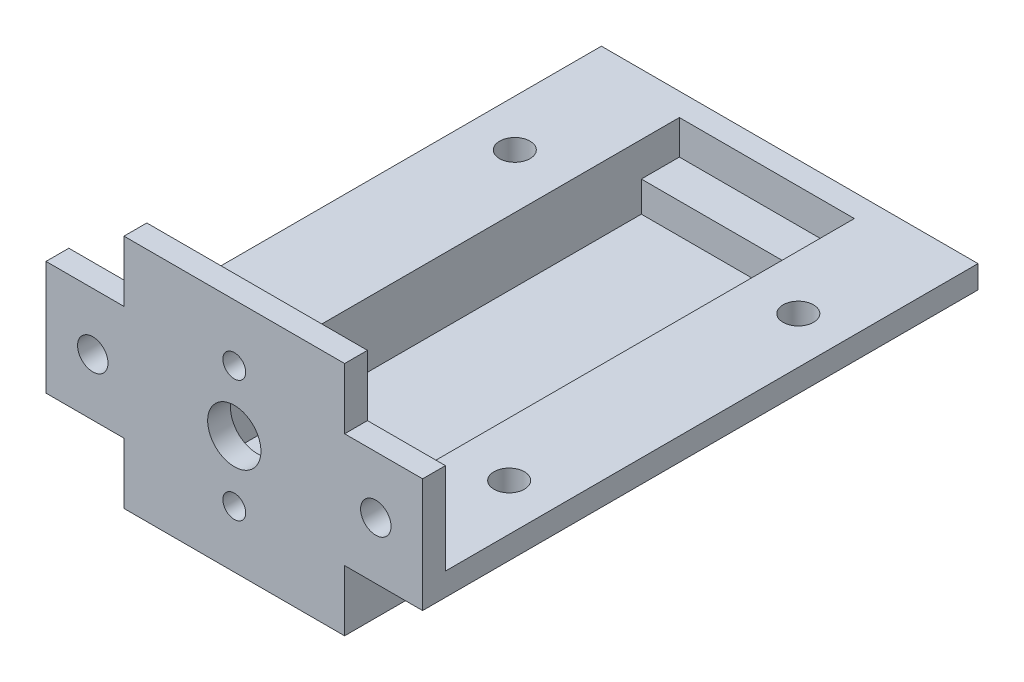
ISO-10303-21;
HEADER;
FILE_DESCRIPTION(('STEP AP214'),'2;1');
FILE_NAME('part.step','',(''),(''),'','','');
FILE_SCHEMA(('AUTOMOTIVE_DESIGN { 1 0 10303 214 1 1 1 1 }'));
ENDSEC;
DATA;
#1=APPLICATION_CONTEXT('core data for automotive mechanical design processes');
#2=APPLICATION_PROTOCOL_DEFINITION('international standard','automotive_design',2000,#1);
#3=PRODUCT_CONTEXT('',#1,'mechanical');
#4=PRODUCT('Part','Part','',(#3));
#5=PRODUCT_RELATED_PRODUCT_CATEGORY('part','',(#4));
#6=PRODUCT_DEFINITION_FORMATION('','',#4);
#7=PRODUCT_DEFINITION_CONTEXT('part definition',#1,'design');
#8=PRODUCT_DEFINITION('design','',#6,#7);
#9=PRODUCT_DEFINITION_SHAPE('','',#8);
#10=(LENGTH_UNIT() NAMED_UNIT(*) SI_UNIT(.MILLI.,.METRE.));
#11=(NAMED_UNIT(*) PLANE_ANGLE_UNIT() SI_UNIT($,.RADIAN.));
#12=(NAMED_UNIT(*) SI_UNIT($,.STERADIAN.) SOLID_ANGLE_UNIT());
#13=UNCERTAINTY_MEASURE_WITH_UNIT(LENGTH_MEASURE(1.E-05),#10,'distance_accuracy_value','');
#14=(GEOMETRIC_REPRESENTATION_CONTEXT(3) GLOBAL_UNCERTAINTY_ASSIGNED_CONTEXT((#13)) GLOBAL_UNIT_ASSIGNED_CONTEXT((#10,
#11,#12)) REPRESENTATION_CONTEXT('',''));
#15=CARTESIAN_POINT('',(0.,0.,0.));
#16=DIRECTION('',(0.,0.,1.));
#17=DIRECTION('',(1.,0.,0.));
#18=AXIS2_PLACEMENT_3D('',#15,#16,#17);
#19=CARTESIAN_POINT('',(-11.5,-12.5,0.));
#20=DIRECTION('',(-1.,0.,0.));
#21=DIRECTION('',(0.,-1.,0.));
#22=AXIS2_PLACEMENT_3D('',#19,#20,#21);
#23=PLANE('',#22);
#24=DIRECTION('',(0.,-1.,0.));
#25=VECTOR('',#24,1.);
#26=CARTESIAN_POINT('',(-11.5,-8.5,-62.));
#27=LINE('',#26,#25);
#28=CARTESIAN_POINT('',(-11.5,-8.5,-62.));
#29=VERTEX_POINT('',#28);
#30=CARTESIAN_POINT('',(-11.5,-12.5,-62.));
#31=VERTEX_POINT('',#30);
#32=EDGE_CURVE('E63',#29,#31,#27,.T.);
#33=ORIENTED_EDGE('',*,*,#32,.F.);
#34=DIRECTION('',(0.,0.,1.));
#35=VECTOR('',#34,1.);
#36=CARTESIAN_POINT('',(-11.5,-8.5,-67.));
#37=LINE('',#36,#35);
#38=CARTESIAN_POINT('',(-11.5,-8.5,-67.));
#39=VERTEX_POINT('',#38);
#40=EDGE_CURVE('E68',#39,#29,#37,.T.);
#41=ORIENTED_EDGE('',*,*,#40,.F.);
#42=DIRECTION('',(0.,1.,0.));
#43=VECTOR('',#42,1.);
#44=CARTESIAN_POINT('',(-11.5,-12.5,-67.));
#45=LINE('',#44,#43);
#46=CARTESIAN_POINT('',(-11.5,-4.,-67.));
#47=VERTEX_POINT('',#46);
#48=EDGE_CURVE('E260',#39,#47,#45,.T.);
#49=ORIENTED_EDGE('',*,*,#48,.T.);
#50=DIRECTION('',(0.,0.,1.));
#51=VECTOR('',#50,1.);
#52=CARTESIAN_POINT('',(-11.5,-4.,0.));
#53=LINE('',#52,#51);
#54=CARTESIAN_POINT('',(-11.5,-4.,0.));
#55=VERTEX_POINT('',#54);
#56=EDGE_CURVE('E250',#47,#55,#53,.T.);
#57=ORIENTED_EDGE('',*,*,#56,.T.);
#58=DIRECTION('',(0.,1.,0.));
#59=VECTOR('',#58,1.);
#60=CARTESIAN_POINT('',(-11.5,-12.5,0.));
#61=LINE('',#60,#59);
#62=CARTESIAN_POINT('',(-11.5,-12.5,0.));
#63=VERTEX_POINT('',#62);
#64=EDGE_CURVE('E194',#63,#55,#61,.T.);
#65=ORIENTED_EDGE('',*,*,#64,.F.);
#66=DIRECTION('',(0.,0.,1.));
#67=VECTOR('',#66,1.);
#68=CARTESIAN_POINT('',(-11.5,-12.5,0.));
#69=LINE('',#68,#67);
#70=EDGE_CURVE('E244',#31,#63,#69,.T.);
#71=ORIENTED_EDGE('',*,*,#70,.F.);
#72=EDGE_LOOP('',(#33,#41,#49,#57,#65,#71));
#73=FACE_BOUND('',#72,.T.);
#74=ADVANCED_FACE('F45',(#73),#23,.F.);
#75=CARTESIAN_POINT('',(11.5,-12.5,0.));
#76=DIRECTION('',(1.,0.,0.));
#77=DIRECTION('',(0.,1.,0.));
#78=AXIS2_PLACEMENT_3D('',#75,#76,#77);
#79=PLANE('',#78);
#80=DIRECTION('',(0.,-1.,0.));
#81=VECTOR('',#80,1.);
#82=CARTESIAN_POINT('',(11.5,-8.5,-62.));
#83=LINE('',#82,#81);
#84=CARTESIAN_POINT('',(11.5,-8.5,-62.));
#85=VERTEX_POINT('',#84);
#86=CARTESIAN_POINT('',(11.5,-12.5,-62.));
#87=VERTEX_POINT('',#86);
#88=EDGE_CURVE('E197',#85,#87,#83,.T.);
#89=ORIENTED_EDGE('',*,*,#88,.T.);
#90=DIRECTION('',(0.,0.,-1.));
#91=VECTOR('',#90,1.);
#92=CARTESIAN_POINT('',(11.5,-12.5,0.));
#93=LINE('',#92,#91);
#94=CARTESIAN_POINT('',(11.5,-12.5,0.));
#95=VERTEX_POINT('',#94);
#96=EDGE_CURVE('E185',#95,#87,#93,.T.);
#97=ORIENTED_EDGE('',*,*,#96,.F.);
#98=DIRECTION('',(0.,1.,0.));
#99=VECTOR('',#98,1.);
#100=CARTESIAN_POINT('',(11.5,-12.5,0.));
#101=LINE('',#100,#99);
#102=CARTESIAN_POINT('',(11.5,-4.00000000000001,0.));
#103=VERTEX_POINT('',#102);
#104=EDGE_CURVE('E267',#95,#103,#101,.T.);
#105=ORIENTED_EDGE('',*,*,#104,.T.);
#106=DIRECTION('',(0.,0.,-1.));
#107=VECTOR('',#106,1.);
#108=CARTESIAN_POINT('',(11.5,-4.00000000000001,0.));
#109=LINE('',#108,#107);
#110=CARTESIAN_POINT('',(11.5,-4.00000000000001,-67.));
#111=VERTEX_POINT('',#110);
#112=EDGE_CURVE('E253',#103,#111,#109,.T.);
#113=ORIENTED_EDGE('',*,*,#112,.T.);
#114=DIRECTION('',(0.,1.,0.));
#115=VECTOR('',#114,1.);
#116=CARTESIAN_POINT('',(11.5,-12.5,-67.));
#117=LINE('',#116,#115);
#118=CARTESIAN_POINT('',(11.5,-8.5,-67.));
#119=VERTEX_POINT('',#118);
#120=EDGE_CURVE('E264',#119,#111,#117,.T.);
#121=ORIENTED_EDGE('',*,*,#120,.F.);
#122=DIRECTION('',(0.,0.,-1.));
#123=VECTOR('',#122,1.);
#124=CARTESIAN_POINT('',(11.5,-8.5,-67.));
#125=LINE('',#124,#123);
#126=EDGE_CURVE('E201',#85,#119,#125,.T.);
#127=ORIENTED_EDGE('',*,*,#126,.F.);
#128=EDGE_LOOP('',(#89,#97,#105,#113,#121,#127));
#129=FACE_BOUND('',#128,.T.);
#130=ADVANCED_FACE('F198',(#129),#79,.F.);
#131=CARTESIAN_POINT('',(0.,-12.5,0.));
#132=DIRECTION('',(0.,-1.,0.));
#133=DIRECTION('',(1.,0.,0.));
#134=AXIS2_PLACEMENT_3D('',#131,#132,#133);
#135=PLANE('',#134);
#136=DIRECTION('',(1.,0.,0.));
#137=VECTOR('',#136,1.);
#138=CARTESIAN_POINT('',(-11.5,-12.5,-62.));
#139=LINE('',#138,#137);
#140=EDGE_CURVE('E189',#31,#87,#139,.T.);
#141=ORIENTED_EDGE('',*,*,#140,.F.);
#142=ORIENTED_EDGE('',*,*,#70,.T.);
#143=DIRECTION('',(1.,0.,0.));
#144=VECTOR('',#143,1.);
#145=CARTESIAN_POINT('',(-11.5,-12.5,0.));
#146=LINE('',#145,#144);
#147=EDGE_CURVE('E191',#63,#95,#146,.T.);
#148=ORIENTED_EDGE('',*,*,#147,.T.);
#149=ORIENTED_EDGE('',*,*,#96,.T.);
#150=EDGE_LOOP('',(#141,#142,#148,#149));
#151=FACE_BOUND('',#150,.T.);
#152=ADVANCED_FACE('F187',(#151),#135,.F.);
#153=CARTESIAN_POINT('',(-14.5,16.,3.));
#154=DIRECTION('',(1.,0.,0.));
#155=DIRECTION('',(0.,1.,0.));
#156=AXIS2_PLACEMENT_3D('',#153,#154,#155);
#157=PLANE('',#156);
#158=DIRECTION('',(0.,-1.,0.));
#159=VECTOR('',#158,1.);
#160=CARTESIAN_POINT('',(-14.5,16.,0.));
#161=LINE('',#160,#159);
#162=CARTESIAN_POINT('',(-14.5,16.,0.));
#163=VERTEX_POINT('',#162);
#164=CARTESIAN_POINT('',(-14.5,8.,0.));
#165=VERTEX_POINT('',#164);
#166=EDGE_CURVE('E316',#163,#165,#161,.T.);
#167=ORIENTED_EDGE('',*,*,#166,.T.);
#168=DIRECTION('',(0.,0.,-1.));
#169=VECTOR('',#168,1.);
#170=CARTESIAN_POINT('',(-14.5,8.,3.));
#171=LINE('',#170,#169);
#172=CARTESIAN_POINT('',(-14.5,8.,3.));
#173=VERTEX_POINT('',#172);
#174=EDGE_CURVE('E11',#173,#165,#171,.T.);
#175=ORIENTED_EDGE('',*,*,#174,.F.);
#176=DIRECTION('',(0.,-1.,0.));
#177=VECTOR('',#176,1.);
#178=CARTESIAN_POINT('',(-14.5,16.,3.));
#179=LINE('',#178,#177);
#180=CARTESIAN_POINT('',(-14.5,16.,3.));
#181=VERTEX_POINT('',#180);
#182=EDGE_CURVE('E317',#181,#173,#179,.T.);
#183=ORIENTED_EDGE('',*,*,#182,.F.);
#184=DIRECTION('',(0.,0.,-1.));
#185=VECTOR('',#184,1.);
#186=CARTESIAN_POINT('',(-14.5,16.,3.));
#187=LINE('',#186,#185);
#188=EDGE_CURVE('E355',#181,#163,#187,.T.);
#189=ORIENTED_EDGE('',*,*,#188,.T.);
#190=EDGE_LOOP('',(#167,#175,#183,#189));
#191=FACE_BOUND('',#190,.T.);
#192=ADVANCED_FACE('F47',(#191),#157,.F.);
#193=CARTESIAN_POINT('',(-14.5,8.,3.));
#194=DIRECTION('',(0.,-1.,0.));
#195=DIRECTION('',(1.,0.,0.));
#196=AXIS2_PLACEMENT_3D('',#193,#194,#195);
#197=PLANE('',#196);
#198=DIRECTION('',(-1.,0.,0.));
#199=VECTOR('',#198,1.);
#200=CARTESIAN_POINT('',(-14.5,8.,0.));
#201=LINE('',#200,#199);
#202=CARTESIAN_POINT('',(-24.75,7.99999999999999,0.));
#203=VERTEX_POINT('',#202);
#204=EDGE_CURVE('E359',#165,#203,#201,.T.);
#205=ORIENTED_EDGE('',*,*,#204,.T.);
#206=DIRECTION('',(0.,0.,-1.));
#207=VECTOR('',#206,1.);
#208=CARTESIAN_POINT('',(-24.75,7.99999999999999,3.));
#209=LINE('',#208,#207);
#210=CARTESIAN_POINT('',(-24.75,7.99999999999999,3.));
#211=VERTEX_POINT('',#210);
#212=EDGE_CURVE('E55',#211,#203,#209,.T.);
#213=ORIENTED_EDGE('',*,*,#212,.F.);
#214=DIRECTION('',(-1.,0.,0.));
#215=VECTOR('',#214,1.);
#216=CARTESIAN_POINT('',(-14.5,8.,3.));
#217=LINE('',#216,#215);
#218=EDGE_CURVE('E321',#173,#211,#217,.T.);
#219=ORIENTED_EDGE('',*,*,#218,.F.);
#220=ORIENTED_EDGE('',*,*,#174,.T.);
#221=EDGE_LOOP('',(#205,#213,#219,#220));
#222=FACE_BOUND('',#221,.T.);
#223=ADVANCED_FACE('F475',(#222),#197,.F.);
#224=CARTESIAN_POINT('',(-24.75,7.99999999999999,3.));
#225=DIRECTION('',(1.,0.,0.));
#226=DIRECTION('',(0.,1.,0.));
#227=AXIS2_PLACEMENT_3D('',#224,#225,#226);
#228=PLANE('',#227);
#229=DIRECTION('',(0.,-1.,0.));
#230=VECTOR('',#229,1.);
#231=CARTESIAN_POINT('',(-24.75,7.99999999999999,0.));
#232=LINE('',#231,#230);
#233=CARTESIAN_POINT('',(-24.75,-4.,0.));
#234=VERTEX_POINT('',#233);
#235=EDGE_CURVE('E362',#203,#234,#232,.T.);
#236=ORIENTED_EDGE('',*,*,#235,.T.);
#237=DIRECTION('',(0.,0.,1.));
#238=VECTOR('',#237,1.);
#239=CARTESIAN_POINT('',(-24.75,-4.,-70.));
#240=LINE('',#239,#238);
#241=CARTESIAN_POINT('',(-24.75,-4.,-70.));
#242=VERTEX_POINT('',#241);
#243=EDGE_CURVE('E305',#242,#234,#240,.T.);
#244=ORIENTED_EDGE('',*,*,#243,.F.);
#245=DIRECTION('',(0.,1.,0.));
#246=VECTOR('',#245,1.);
#247=CARTESIAN_POINT('',(-24.75,-7.00000000000001,-70.));
#248=LINE('',#247,#246);
#249=CARTESIAN_POINT('',(-24.75,-7.00000000000001,-70.));
#250=VERTEX_POINT('',#249);
#251=EDGE_CURVE('E302',#250,#242,#248,.T.);
#252=ORIENTED_EDGE('',*,*,#251,.F.);
#253=DIRECTION('',(0.,0.,-1.));
#254=VECTOR('',#253,1.);
#255=CARTESIAN_POINT('',(-24.75,-7.,3.));
#256=LINE('',#255,#254);
#257=CARTESIAN_POINT('',(-24.75,-7.,3.));
#258=VERTEX_POINT('',#257);
#259=EDGE_CURVE('E407',#258,#250,#256,.T.);
#260=ORIENTED_EDGE('',*,*,#259,.F.);
#261=DIRECTION('',(0.,-1.,0.));
#262=VECTOR('',#261,1.);
#263=CARTESIAN_POINT('',(-24.75,7.99999999999999,3.));
#264=LINE('',#263,#262);
#265=EDGE_CURVE('E325',#211,#258,#264,.T.);
#266=ORIENTED_EDGE('',*,*,#265,.F.);
#267=ORIENTED_EDGE('',*,*,#212,.T.);
#268=EDGE_LOOP('',(#236,#244,#252,#260,#266,#267));
#269=FACE_BOUND('',#268,.T.);
#270=ADVANCED_FACE('F454',(#269),#228,.F.);
#271=CARTESIAN_POINT('',(-24.75,-7.,3.));
#272=DIRECTION('',(0.,1.,0.));
#273=DIRECTION('',(0.,0.,1.));
#274=AXIS2_PLACEMENT_3D('',#271,#272,#273);
#275=PLANE('',#274);
#276=CARTESIAN_POINT('',(-18.63,-7.,-14.5));
#277=DIRECTION('',(0.,1.,0.));
#278=DIRECTION('',(0.,0.,1.));
#279=AXIS2_PLACEMENT_3D('',#276,#277,#278);
#280=CIRCLE('',#279,2.00000000000001);
#281=CARTESIAN_POINT('',(-18.63,-7.,-12.5));
#282=VERTEX_POINT('',#281);
#283=EDGE_CURVE('E718',#282,#282,#280,.T.);
#284=ORIENTED_EDGE('',*,*,#283,.T.);
#285=EDGE_LOOP('',(#284));
#286=FACE_BOUND('',#285,.T.);
#287=CARTESIAN_POINT('',(-18.63,-7.,-52.5));
#288=DIRECTION('',(0.,1.,0.));
#289=DIRECTION('',(0.,0.,1.));
#290=AXIS2_PLACEMENT_3D('',#287,#288,#289);
#291=CIRCLE('',#290,2.);
#292=CARTESIAN_POINT('',(-18.63,-7.,-50.5));
#293=VERTEX_POINT('',#292);
#294=EDGE_CURVE('E722',#293,#293,#291,.T.);
#295=ORIENTED_EDGE('',*,*,#294,.T.);
#296=EDGE_LOOP('',(#295));
#297=FACE_BOUND('',#296,.T.);
#298=ORIENTED_EDGE('',*,*,#259,.T.);
#299=DIRECTION('',(-1.,0.,0.));
#300=VECTOR('',#299,1.);
#301=CARTESIAN_POINT('',(-14.5,-7.00000000000001,-70.));
#302=LINE('',#301,#300);
#303=CARTESIAN_POINT('',(-14.5,-7.00000000000001,-70.));
#304=VERTEX_POINT('',#303);
#305=EDGE_CURVE('E298',#304,#250,#302,.T.);
#306=ORIENTED_EDGE('',*,*,#305,.F.);
#307=DIRECTION('',(0.,0.,-1.));
#308=VECTOR('',#307,1.);
#309=CARTESIAN_POINT('',(-14.5,-7.,3.));
#310=LINE('',#309,#308);
#311=CARTESIAN_POINT('',(-14.5,-7.,3.));
#312=VERTEX_POINT('',#311);
#313=EDGE_CURVE('E404',#312,#304,#310,.T.);
#314=ORIENTED_EDGE('',*,*,#313,.F.);
#315=DIRECTION('',(1.,0.,0.));
#316=VECTOR('',#315,1.);
#317=CARTESIAN_POINT('',(-24.75,-7.,3.));
#318=LINE('',#317,#316);
#319=EDGE_CURVE('E328',#258,#312,#318,.T.);
#320=ORIENTED_EDGE('',*,*,#319,.F.);
#321=EDGE_LOOP('',(#298,#306,#314,#320));
#322=FACE_BOUND('',#321,.T.);
#323=ADVANCED_FACE('F468',(#286,#297,#322),#275,.F.);
#324=CARTESIAN_POINT('',(-14.5,-7.,3.));
#325=DIRECTION('',(1.,0.,0.));
#326=DIRECTION('',(0.,1.,0.));
#327=AXIS2_PLACEMENT_3D('',#324,#325,#326);
#328=PLANE('',#327);
#329=ORIENTED_EDGE('',*,*,#313,.T.);
#330=DIRECTION('',(0.,1.,0.));
#331=VECTOR('',#330,1.);
#332=CARTESIAN_POINT('',(-14.5,-15.,-70.));
#333=LINE('',#332,#331);
#334=CARTESIAN_POINT('',(-14.5,-15.,-70.));
#335=VERTEX_POINT('',#334);
#336=EDGE_CURVE('E294',#335,#304,#333,.T.);
#337=ORIENTED_EDGE('',*,*,#336,.F.);
#338=DIRECTION('',(0.,0.,-1.));
#339=VECTOR('',#338,1.);
#340=CARTESIAN_POINT('',(-14.5,-15.,3.));
#341=LINE('',#340,#339);
#342=CARTESIAN_POINT('',(-14.5,-15.,3.));
#343=VERTEX_POINT('',#342);
#344=EDGE_CURVE('E401',#343,#335,#341,.T.);
#345=ORIENTED_EDGE('',*,*,#344,.F.);
#346=DIRECTION('',(0.,-1.,0.));
#347=VECTOR('',#346,1.);
#348=CARTESIAN_POINT('',(-14.5,-7.,3.));
#349=LINE('',#348,#347);
#350=EDGE_CURVE('E331',#312,#343,#349,.T.);
#351=ORIENTED_EDGE('',*,*,#350,.F.);
#352=EDGE_LOOP('',(#329,#337,#345,#351));
#353=FACE_BOUND('',#352,.T.);
#354=ADVANCED_FACE('F515',(#353),#328,.F.);
#355=CARTESIAN_POINT('',(-14.5,-15.,3.));
#356=DIRECTION('',(0.,1.,0.));
#357=DIRECTION('',(0.,0.,1.));
#358=AXIS2_PLACEMENT_3D('',#355,#356,#357);
#359=PLANE('',#358);
#360=ORIENTED_EDGE('',*,*,#344,.T.);
#361=DIRECTION('',(-1.,0.,0.));
#362=VECTOR('',#361,1.);
#363=CARTESIAN_POINT('',(14.5,-15.,-70.));
#364=LINE('',#363,#362);
#365=CARTESIAN_POINT('',(14.5,-15.,-70.));
#366=VERTEX_POINT('',#365);
#367=EDGE_CURVE('E290',#366,#335,#364,.T.);
#368=ORIENTED_EDGE('',*,*,#367,.F.);
#369=DIRECTION('',(0.,0.,-1.));
#370=VECTOR('',#369,1.);
#371=CARTESIAN_POINT('',(14.5,-15.,3.));
#372=LINE('',#371,#370);
#373=CARTESIAN_POINT('',(14.5,-15.,3.));
#374=VERTEX_POINT('',#373);
#375=EDGE_CURVE('E398',#374,#366,#372,.T.);
#376=ORIENTED_EDGE('',*,*,#375,.F.);
#377=DIRECTION('',(1.,0.,0.));
#378=VECTOR('',#377,1.);
#379=CARTESIAN_POINT('',(-14.5,-15.,3.));
#380=LINE('',#379,#378);
#381=EDGE_CURVE('E334',#343,#374,#380,.T.);
#382=ORIENTED_EDGE('',*,*,#381,.F.);
#383=EDGE_LOOP('',(#360,#368,#376,#382));
#384=FACE_BOUND('',#383,.T.);
#385=ADVANCED_FACE('F512',(#384),#359,.F.);
#386=CARTESIAN_POINT('',(14.5,-7.00000000000001,3.));
#387=DIRECTION('',(-1.,0.,0.));
#388=DIRECTION('',(0.,0.,1.));
#389=AXIS2_PLACEMENT_3D('',#386,#387,#388);
#390=PLANE('',#389);
#391=ORIENTED_EDGE('',*,*,#375,.T.);
#392=DIRECTION('',(0.,-1.,0.));
#393=VECTOR('',#392,1.);
#394=CARTESIAN_POINT('',(14.5,-7.00000000000001,-70.));
#395=LINE('',#394,#393);
#396=CARTESIAN_POINT('',(14.5,-7.00000000000001,-70.));
#397=VERTEX_POINT('',#396);
#398=EDGE_CURVE('E286',#397,#366,#395,.T.);
#399=ORIENTED_EDGE('',*,*,#398,.F.);
#400=DIRECTION('',(0.,0.,-1.));
#401=VECTOR('',#400,1.);
#402=CARTESIAN_POINT('',(14.5,-7.00000000000001,3.));
#403=LINE('',#402,#401);
#404=CARTESIAN_POINT('',(14.5,-7.00000000000001,3.));
#405=VERTEX_POINT('',#404);
#406=EDGE_CURVE('E395',#405,#397,#403,.T.);
#407=ORIENTED_EDGE('',*,*,#406,.F.);
#408=DIRECTION('',(0.,1.,0.));
#409=VECTOR('',#408,1.);
#410=CARTESIAN_POINT('',(14.5,-7.00000000000001,3.));
#411=LINE('',#410,#409);
#412=EDGE_CURVE('E337',#374,#405,#411,.T.);
#413=ORIENTED_EDGE('',*,*,#412,.F.);
#414=EDGE_LOOP('',(#391,#399,#407,#413));
#415=FACE_BOUND('',#414,.T.);
#416=ADVANCED_FACE('F507',(#415),#390,.F.);
#417=CARTESIAN_POINT('',(24.75,-7.,3.));
#418=DIRECTION('',(0.,1.,0.));
#419=DIRECTION('',(-1.,0.,0.));
#420=AXIS2_PLACEMENT_3D('',#417,#418,#419);
#421=PLANE('',#420);
#422=CARTESIAN_POINT('',(18.63,-7.00000000000001,-52.5));
#423=DIRECTION('',(0.,1.,0.));
#424=DIRECTION('',(-1.,0.,0.));
#425=AXIS2_PLACEMENT_3D('',#422,#423,#424);
#426=CIRCLE('',#425,2.);
#427=CARTESIAN_POINT('',(16.63,-7.00000000000001,-52.5));
#428=VERTEX_POINT('',#427);
#429=EDGE_CURVE('E209',#428,#428,#426,.T.);
#430=ORIENTED_EDGE('',*,*,#429,.T.);
#431=EDGE_LOOP('',(#430));
#432=FACE_BOUND('',#431,.T.);
#433=CARTESIAN_POINT('',(18.63,-7.00000000000001,-14.5));
#434=DIRECTION('',(0.,1.,0.));
#435=DIRECTION('',(-1.,0.,0.));
#436=AXIS2_PLACEMENT_3D('',#433,#434,#435);
#437=CIRCLE('',#436,2.00000000000001);
#438=CARTESIAN_POINT('',(16.63,-7.00000000000001,-14.5));
#439=VERTEX_POINT('',#438);
#440=EDGE_CURVE('E216',#439,#439,#437,.T.);
#441=ORIENTED_EDGE('',*,*,#440,.T.);
#442=EDGE_LOOP('',(#441));
#443=FACE_BOUND('',#442,.T.);
#444=ORIENTED_EDGE('',*,*,#406,.T.);
#445=DIRECTION('',(-1.,0.,0.));
#446=VECTOR('',#445,1.);
#447=CARTESIAN_POINT('',(24.75,-7.00000000000001,-70.));
#448=LINE('',#447,#446);
#449=CARTESIAN_POINT('',(24.75,-7.00000000000001,-70.));
#450=VERTEX_POINT('',#449);
#451=EDGE_CURVE('E282',#450,#397,#448,.T.);
#452=ORIENTED_EDGE('',*,*,#451,.F.);
#453=DIRECTION('',(0.,0.,-1.));
#454=VECTOR('',#453,1.);
#455=CARTESIAN_POINT('',(24.75,-7.,3.));
#456=LINE('',#455,#454);
#457=CARTESIAN_POINT('',(24.75,-7.,3.));
#458=VERTEX_POINT('',#457);
#459=EDGE_CURVE('E392',#458,#450,#456,.T.);
#460=ORIENTED_EDGE('',*,*,#459,.F.);
#461=DIRECTION('',(1.,0.,0.));
#462=VECTOR('',#461,1.);
#463=CARTESIAN_POINT('',(24.75,-7.,3.));
#464=LINE('',#463,#462);
#465=EDGE_CURVE('E340',#405,#458,#464,.T.);
#466=ORIENTED_EDGE('',*,*,#465,.F.);
#467=EDGE_LOOP('',(#444,#452,#460,#466));
#468=FACE_BOUND('',#467,.T.);
#469=ADVANCED_FACE('F502',(#432,#443,#468),#421,.F.);
#470=CARTESIAN_POINT('',(24.75,8.,3.));
#471=DIRECTION('',(-1.,0.,0.));
#472=DIRECTION('',(0.,-1.,0.));
#473=AXIS2_PLACEMENT_3D('',#470,#471,#472);
#474=PLANE('',#473);
#475=ORIENTED_EDGE('',*,*,#459,.T.);
#476=DIRECTION('',(0.,-1.,0.));
#477=VECTOR('',#476,1.);
#478=CARTESIAN_POINT('',(24.75,-4.00000000000001,-70.));
#479=LINE('',#478,#477);
#480=CARTESIAN_POINT('',(24.75,-4.00000000000001,-70.));
#481=VERTEX_POINT('',#480);
#482=EDGE_CURVE('E277',#481,#450,#479,.T.);
#483=ORIENTED_EDGE('',*,*,#482,.F.);
#484=DIRECTION('',(0.,0.,1.));
#485=VECTOR('',#484,1.);
#486=CARTESIAN_POINT('',(24.75,-4.00000000000001,-70.));
#487=LINE('',#486,#485);
#488=CARTESIAN_POINT('',(24.75,-4.00000000000001,0.));
#489=VERTEX_POINT('',#488);
#490=EDGE_CURVE('E312',#481,#489,#487,.T.);
#491=ORIENTED_EDGE('',*,*,#490,.T.);
#492=DIRECTION('',(0.,1.,0.));
#493=VECTOR('',#492,1.);
#494=CARTESIAN_POINT('',(24.75,8.,0.));
#495=LINE('',#494,#493);
#496=CARTESIAN_POINT('',(24.75,8.,0.));
#497=VERTEX_POINT('',#496);
#498=EDGE_CURVE('E366',#489,#497,#495,.T.);
#499=ORIENTED_EDGE('',*,*,#498,.T.);
#500=DIRECTION('',(0.,0.,-1.));
#501=VECTOR('',#500,1.);
#502=CARTESIAN_POINT('',(24.75,8.,3.));
#503=LINE('',#502,#501);
#504=CARTESIAN_POINT('',(24.75,8.,3.));
#505=VERTEX_POINT('',#504);
#506=EDGE_CURVE('E388',#505,#497,#503,.T.);
#507=ORIENTED_EDGE('',*,*,#506,.F.);
#508=DIRECTION('',(0.,1.,0.));
#509=VECTOR('',#508,1.);
#510=CARTESIAN_POINT('',(24.75,8.,3.));
#511=LINE('',#510,#509);
#512=EDGE_CURVE('E343',#458,#505,#511,.T.);
#513=ORIENTED_EDGE('',*,*,#512,.F.);
#514=EDGE_LOOP('',(#475,#483,#491,#499,#507,#513));
#515=FACE_BOUND('',#514,.T.);
#516=ADVANCED_FACE('F498',(#515),#474,.F.);
#517=CARTESIAN_POINT('',(14.5,8.,3.));
#518=DIRECTION('',(0.,-1.,0.));
#519=DIRECTION('',(1.,0.,0.));
#520=AXIS2_PLACEMENT_3D('',#517,#518,#519);
#521=PLANE('',#520);
#522=DIRECTION('',(-1.,0.,0.));
#523=VECTOR('',#522,1.);
#524=CARTESIAN_POINT('',(14.5,8.,0.));
#525=LINE('',#524,#523);
#526=CARTESIAN_POINT('',(14.5,8.,0.));
#527=VERTEX_POINT('',#526);
#528=EDGE_CURVE('E369',#497,#527,#525,.T.);
#529=ORIENTED_EDGE('',*,*,#528,.T.);
#530=DIRECTION('',(0.,0.,-1.));
#531=VECTOR('',#530,1.);
#532=CARTESIAN_POINT('',(14.5,8.,3.));
#533=LINE('',#532,#531);
#534=CARTESIAN_POINT('',(14.5,8.,3.));
#535=VERTEX_POINT('',#534);
#536=EDGE_CURVE('E384',#535,#527,#533,.T.);
#537=ORIENTED_EDGE('',*,*,#536,.F.);
#538=DIRECTION('',(-1.,0.,0.));
#539=VECTOR('',#538,1.);
#540=CARTESIAN_POINT('',(14.5,8.,3.));
#541=LINE('',#540,#539);
#542=EDGE_CURVE('E346',#505,#535,#541,.T.);
#543=ORIENTED_EDGE('',*,*,#542,.F.);
#544=ORIENTED_EDGE('',*,*,#506,.T.);
#545=EDGE_LOOP('',(#529,#537,#543,#544));
#546=FACE_BOUND('',#545,.T.);
#547=ADVANCED_FACE('F493',(#546),#521,.F.);
#548=CARTESIAN_POINT('',(14.5,16.,3.));
#549=DIRECTION('',(-1.,0.,0.));
#550=DIRECTION('',(0.,-1.,0.));
#551=AXIS2_PLACEMENT_3D('',#548,#549,#550);
#552=PLANE('',#551);
#553=DIRECTION('',(0.,1.,0.));
#554=VECTOR('',#553,1.);
#555=CARTESIAN_POINT('',(14.5,16.,0.));
#556=LINE('',#555,#554);
#557=CARTESIAN_POINT('',(14.5,16.,0.));
#558=VERTEX_POINT('',#557);
#559=EDGE_CURVE('E372',#527,#558,#556,.T.);
#560=ORIENTED_EDGE('',*,*,#559,.T.);
#561=DIRECTION('',(0.,0.,-1.));
#562=VECTOR('',#561,1.);
#563=CARTESIAN_POINT('',(14.5,16.,3.));
#564=LINE('',#563,#562);
#565=CARTESIAN_POINT('',(14.5,16.,3.));
#566=VERTEX_POINT('',#565);
#567=EDGE_CURVE('E380',#566,#558,#564,.T.);
#568=ORIENTED_EDGE('',*,*,#567,.F.);
#569=DIRECTION('',(0.,1.,0.));
#570=VECTOR('',#569,1.);
#571=CARTESIAN_POINT('',(14.5,16.,3.));
#572=LINE('',#571,#570);
#573=EDGE_CURVE('E349',#535,#566,#572,.T.);
#574=ORIENTED_EDGE('',*,*,#573,.F.);
#575=ORIENTED_EDGE('',*,*,#536,.T.);
#576=EDGE_LOOP('',(#560,#568,#574,#575));
#577=FACE_BOUND('',#576,.T.);
#578=ADVANCED_FACE('F487',(#577),#552,.F.);
#579=CARTESIAN_POINT('',(14.5,16.,3.));
#580=DIRECTION('',(0.,-1.,0.));
#581=DIRECTION('',(1.,0.,0.));
#582=AXIS2_PLACEMENT_3D('',#579,#580,#581);
#583=PLANE('',#582);
#584=DIRECTION('',(-1.,0.,0.));
#585=VECTOR('',#584,1.);
#586=CARTESIAN_POINT('',(14.5,16.,0.));
#587=LINE('',#586,#585);
#588=EDGE_CURVE('E322',#558,#163,#587,.T.);
#589=ORIENTED_EDGE('',*,*,#588,.T.);
#590=ORIENTED_EDGE('',*,*,#188,.F.);
#591=DIRECTION('',(-1.,0.,0.));
#592=VECTOR('',#591,1.);
#593=CARTESIAN_POINT('',(14.5,16.,3.));
#594=LINE('',#593,#592);
#595=EDGE_CURVE('E352',#566,#181,#594,.T.);
#596=ORIENTED_EDGE('',*,*,#595,.F.);
#597=ORIENTED_EDGE('',*,*,#567,.T.);
#598=EDGE_LOOP('',(#589,#590,#596,#597));
#599=FACE_BOUND('',#598,.T.);
#600=ADVANCED_FACE('F483',(#599),#583,.F.);
#601=CARTESIAN_POINT('',(0.,0.,3.));
#602=DIRECTION('',(0.,0.,-1.));
#603=DIRECTION('',(-1.,0.,0.));
#604=AXIS2_PLACEMENT_3D('',#601,#602,#603);
#605=PLANE('',#604);
#606=CARTESIAN_POINT('',(-18.6,0.499999999999997,3.));
#607=DIRECTION('',(0.,0.,1.));
#608=DIRECTION('',(1.,0.,0.));
#609=AXIS2_PLACEMENT_3D('',#606,#607,#608);
#610=CIRCLE('',#609,2.);
#611=CARTESIAN_POINT('',(-16.6,0.499999999999997,3.));
#612=VERTEX_POINT('',#611);
#613=EDGE_CURVE('E232',#612,#612,#610,.T.);
#614=ORIENTED_EDGE('',*,*,#613,.F.);
#615=EDGE_LOOP('',(#614));
#616=FACE_BOUND('',#615,.T.);
#617=CARTESIAN_POINT('',(18.6,0.499999999999997,3.));
#618=DIRECTION('',(0.,0.,1.));
#619=DIRECTION('',(-1.,0.,0.));
#620=AXIS2_PLACEMENT_3D('',#617,#618,#619);
#621=CIRCLE('',#620,2.);
#622=CARTESIAN_POINT('',(16.6,0.499999999999997,3.));
#623=VERTEX_POINT('',#622);
#624=EDGE_CURVE('E228',#623,#623,#621,.T.);
#625=ORIENTED_EDGE('',*,*,#624,.F.);
#626=EDGE_LOOP('',(#625));
#627=FACE_BOUND('',#626,.T.);
#628=CARTESIAN_POINT('',(0.,8.5,3.));
#629=DIRECTION('',(0.,0.,1.));
#630=DIRECTION('',(1.,0.,0.));
#631=AXIS2_PLACEMENT_3D('',#628,#629,#630);
#632=CIRCLE('',#631,1.5);
#633=CARTESIAN_POINT('',(1.5,8.5,3.));
#634=VERTEX_POINT('',#633);
#635=EDGE_CURVE('E224',#634,#634,#632,.T.);
#636=ORIENTED_EDGE('',*,*,#635,.F.);
#637=EDGE_LOOP('',(#636));
#638=FACE_BOUND('',#637,.T.);
#639=CARTESIAN_POINT('',(0.,-7.50000000000001,3.));
#640=DIRECTION('',(0.,0.,1.));
#641=DIRECTION('',(-1.,0.,0.));
#642=AXIS2_PLACEMENT_3D('',#639,#640,#641);
#643=CIRCLE('',#642,1.5);
#644=CARTESIAN_POINT('',(-1.5,-7.50000000000001,3.));
#645=VERTEX_POINT('',#644);
#646=EDGE_CURVE('E223',#645,#645,#643,.T.);
#647=ORIENTED_EDGE('',*,*,#646,.F.);
#648=EDGE_LOOP('',(#647));
#649=FACE_BOUND('',#648,.T.);
#650=CARTESIAN_POINT('',(0.,0.499999999999997,3.));
#651=DIRECTION('',(0.,0.,1.));
#652=DIRECTION('',(1.,0.,0.));
#653=AXIS2_PLACEMENT_3D('',#650,#651,#652);
#654=CIRCLE('',#653,3.5);
#655=CARTESIAN_POINT('',(3.5,0.499999999999997,3.));
#656=VERTEX_POINT('',#655);
#657=EDGE_CURVE('E236',#656,#656,#654,.T.);
#658=ORIENTED_EDGE('',*,*,#657,.F.);
#659=EDGE_LOOP('',(#658));
#660=FACE_BOUND('',#659,.T.);
#661=ORIENTED_EDGE('',*,*,#182,.T.);
#662=ORIENTED_EDGE('',*,*,#218,.T.);
#663=ORIENTED_EDGE('',*,*,#265,.T.);
#664=ORIENTED_EDGE('',*,*,#319,.T.);
#665=ORIENTED_EDGE('',*,*,#350,.T.);
#666=ORIENTED_EDGE('',*,*,#381,.T.);
#667=ORIENTED_EDGE('',*,*,#412,.T.);
#668=ORIENTED_EDGE('',*,*,#465,.T.);
#669=ORIENTED_EDGE('',*,*,#512,.T.);
#670=ORIENTED_EDGE('',*,*,#542,.T.);
#671=ORIENTED_EDGE('',*,*,#573,.T.);
#672=ORIENTED_EDGE('',*,*,#595,.T.);
#673=EDGE_LOOP('',(#661,#662,#663,#664,#665,#666,#667,#668,#669,#670,#671,#672));
#674=FACE_BOUND('',#673,.T.);
#675=ADVANCED_FACE('F439',(#616,#627,#638,#649,#660,#674),#605,.F.);
#676=CARTESIAN_POINT('',(0.,0.,0.));
#677=DIRECTION('',(0.,0.,-1.));
#678=DIRECTION('',(-1.,0.,0.));
#679=AXIS2_PLACEMENT_3D('',#676,#677,#678);
#680=PLANE('',#679);
#681=CARTESIAN_POINT('',(-18.6,0.499999999999997,0.));
#682=DIRECTION('',(0.,0.,-1.));
#683=DIRECTION('',(-1.,0.,0.));
#684=AXIS2_PLACEMENT_3D('',#681,#682,#683);
#685=CIRCLE('',#684,2.);
#686=CARTESIAN_POINT('',(-20.6,0.499999999999997,0.));
#687=VERTEX_POINT('',#686);
#688=EDGE_CURVE('E49',#687,#687,#685,.T.);
#689=ORIENTED_EDGE('',*,*,#688,.F.);
#690=EDGE_LOOP('',(#689));
#691=FACE_BOUND('',#690,.T.);
#692=CARTESIAN_POINT('',(18.6,0.499999999999997,0.));
#693=DIRECTION('',(0.,0.,-1.));
#694=DIRECTION('',(-1.,0.,0.));
#695=AXIS2_PLACEMENT_3D('',#692,#693,#694);
#696=CIRCLE('',#695,2.);
#697=CARTESIAN_POINT('',(16.6,0.499999999999997,0.));
#698=VERTEX_POINT('',#697);
#699=EDGE_CURVE('E423',#698,#698,#696,.T.);
#700=ORIENTED_EDGE('',*,*,#699,.F.);
#701=EDGE_LOOP('',(#700));
#702=FACE_BOUND('',#701,.T.);
#703=CARTESIAN_POINT('',(0.,8.5,0.));
#704=DIRECTION('',(0.,0.,-1.));
#705=DIRECTION('',(-1.,0.,0.));
#706=AXIS2_PLACEMENT_3D('',#703,#704,#705);
#707=CIRCLE('',#706,1.5);
#708=CARTESIAN_POINT('',(-1.5,8.5,0.));
#709=VERTEX_POINT('',#708);
#710=EDGE_CURVE('E420',#709,#709,#707,.T.);
#711=ORIENTED_EDGE('',*,*,#710,.F.);
#712=EDGE_LOOP('',(#711));
#713=FACE_BOUND('',#712,.T.);
#714=CARTESIAN_POINT('',(0.,-7.50000000000001,0.));
#715=DIRECTION('',(0.,0.,-1.));
#716=DIRECTION('',(-1.,0.,0.));
#717=AXIS2_PLACEMENT_3D('',#714,#715,#716);
#718=CIRCLE('',#717,1.5);
#719=CARTESIAN_POINT('',(-1.5,-7.50000000000001,0.));
#720=VERTEX_POINT('',#719);
#721=EDGE_CURVE('E416',#720,#720,#718,.T.);
#722=ORIENTED_EDGE('',*,*,#721,.F.);
#723=EDGE_LOOP('',(#722));
#724=FACE_BOUND('',#723,.T.);
#725=CARTESIAN_POINT('',(0.,0.499999999999997,0.));
#726=DIRECTION('',(0.,0.,-1.));
#727=DIRECTION('',(-1.,0.,0.));
#728=AXIS2_PLACEMENT_3D('',#725,#726,#727);
#729=CIRCLE('',#728,3.5);
#730=CARTESIAN_POINT('',(-3.5,0.499999999999997,0.));
#731=VERTEX_POINT('',#730);
#732=EDGE_CURVE('E243',#731,#731,#729,.T.);
#733=ORIENTED_EDGE('',*,*,#732,.F.);
#734=EDGE_LOOP('',(#733));
#735=FACE_BOUND('',#734,.T.);
#736=DIRECTION('',(1.,0.,0.));
#737=VECTOR('',#736,1.);
#738=CARTESIAN_POINT('',(-24.75,-4.,0.));
#739=LINE('',#738,#737);
#740=EDGE_CURVE('E278',#234,#55,#739,.T.);
#741=ORIENTED_EDGE('',*,*,#740,.F.);
#742=ORIENTED_EDGE('',*,*,#235,.F.);
#743=ORIENTED_EDGE('',*,*,#204,.F.);
#744=ORIENTED_EDGE('',*,*,#166,.F.);
#745=ORIENTED_EDGE('',*,*,#588,.F.);
#746=ORIENTED_EDGE('',*,*,#559,.F.);
#747=ORIENTED_EDGE('',*,*,#528,.F.);
#748=ORIENTED_EDGE('',*,*,#498,.F.);
#749=EDGE_CURVE('E263',#103,#489,#739,.T.);
#750=ORIENTED_EDGE('',*,*,#749,.F.);
#751=ORIENTED_EDGE('',*,*,#104,.F.);
#752=ORIENTED_EDGE('',*,*,#147,.F.);
#753=ORIENTED_EDGE('',*,*,#64,.T.);
#754=EDGE_LOOP('',(#741,#742,#743,#744,#745,#746,#747,#748,#750,#751,#752,#753));
#755=FACE_BOUND('',#754,.T.);
#756=ADVANCED_FACE('F435',(#691,#702,#713,#724,#735,#755),#680,.T.);
#757=CARTESIAN_POINT('',(-24.75,-4.,-70.));
#758=DIRECTION('',(0.,-1.,0.));
#759=DIRECTION('',(1.,0.,0.));
#760=AXIS2_PLACEMENT_3D('',#757,#758,#759);
#761=PLANE('',#760);
#762=CARTESIAN_POINT('',(18.63,-4.00000000000001,-52.5));
#763=DIRECTION('',(0.,1.,0.));
#764=DIRECTION('',(1.,0.,0.));
#765=AXIS2_PLACEMENT_3D('',#762,#763,#764);
#766=CIRCLE('',#765,2.);
#767=CARTESIAN_POINT('',(20.63,-4.00000000000001,-52.5));
#768=VERTEX_POINT('',#767);
#769=EDGE_CURVE('E731',#768,#768,#766,.T.);
#770=ORIENTED_EDGE('',*,*,#769,.F.);
#771=EDGE_LOOP('',(#770));
#772=FACE_BOUND('',#771,.T.);
#773=CARTESIAN_POINT('',(18.63,-4.00000000000001,-14.5));
#774=DIRECTION('',(0.,1.,0.));
#775=DIRECTION('',(-1.,0.,0.));
#776=AXIS2_PLACEMENT_3D('',#773,#774,#775);
#777=CIRCLE('',#776,2.00000000000001);
#778=CARTESIAN_POINT('',(16.63,-4.00000000000001,-14.5));
#779=VERTEX_POINT('',#778);
#780=EDGE_CURVE('E734',#779,#779,#777,.T.);
#781=ORIENTED_EDGE('',*,*,#780,.F.);
#782=EDGE_LOOP('',(#781));
#783=FACE_BOUND('',#782,.T.);
#784=CARTESIAN_POINT('',(-18.63,-4.,-14.5));
#785=DIRECTION('',(0.,1.,0.));
#786=DIRECTION('',(1.,0.,0.));
#787=AXIS2_PLACEMENT_3D('',#784,#785,#786);
#788=CIRCLE('',#787,2.00000000000001);
#789=CARTESIAN_POINT('',(-16.63,-4.,-14.5));
#790=VERTEX_POINT('',#789);
#791=EDGE_CURVE('E730',#790,#790,#788,.T.);
#792=ORIENTED_EDGE('',*,*,#791,.F.);
#793=EDGE_LOOP('',(#792));
#794=FACE_BOUND('',#793,.T.);
#795=CARTESIAN_POINT('',(-18.63,-4.,-52.5));
#796=DIRECTION('',(0.,1.,0.));
#797=DIRECTION('',(-1.,0.,0.));
#798=AXIS2_PLACEMENT_3D('',#795,#796,#797);
#799=CIRCLE('',#798,2.);
#800=CARTESIAN_POINT('',(-20.63,-4.,-52.5));
#801=VERTEX_POINT('',#800);
#802=EDGE_CURVE('E726',#801,#801,#799,.T.);
#803=ORIENTED_EDGE('',*,*,#802,.F.);
#804=EDGE_LOOP('',(#803));
#805=FACE_BOUND('',#804,.T.);
#806=ORIENTED_EDGE('',*,*,#740,.T.);
#807=ORIENTED_EDGE('',*,*,#56,.F.);
#808=DIRECTION('',(-1.,0.,0.));
#809=VECTOR('',#808,1.);
#810=CARTESIAN_POINT('',(-11.5,-4.,-67.));
#811=LINE('',#810,#809);
#812=EDGE_CURVE('E247',#111,#47,#811,.T.);
#813=ORIENTED_EDGE('',*,*,#812,.F.);
#814=ORIENTED_EDGE('',*,*,#112,.F.);
#815=ORIENTED_EDGE('',*,*,#749,.T.);
#816=ORIENTED_EDGE('',*,*,#490,.F.);
#817=DIRECTION('',(1.,0.,0.));
#818=VECTOR('',#817,1.);
#819=CARTESIAN_POINT('',(-24.75,-4.,-70.));
#820=LINE('',#819,#818);
#821=EDGE_CURVE('E273',#242,#481,#820,.T.);
#822=ORIENTED_EDGE('',*,*,#821,.F.);
#823=ORIENTED_EDGE('',*,*,#243,.T.);
#824=EDGE_LOOP('',(#806,#807,#813,#814,#815,#816,#822,#823));
#825=FACE_BOUND('',#824,.T.);
#826=ADVANCED_FACE('F438',(#772,#783,#794,#805,#825),#761,.F.);
#827=CARTESIAN_POINT('',(0.,0.,-70.));
#828=DIRECTION('',(0.,0.,-1.));
#829=DIRECTION('',(-1.,0.,0.));
#830=AXIS2_PLACEMENT_3D('',#827,#828,#829);
#831=PLANE('',#830);
#832=ORIENTED_EDGE('',*,*,#821,.T.);
#833=ORIENTED_EDGE('',*,*,#482,.T.);
#834=ORIENTED_EDGE('',*,*,#451,.T.);
#835=ORIENTED_EDGE('',*,*,#398,.T.);
#836=ORIENTED_EDGE('',*,*,#367,.T.);
#837=ORIENTED_EDGE('',*,*,#336,.T.);
#838=ORIENTED_EDGE('',*,*,#305,.T.);
#839=ORIENTED_EDGE('',*,*,#251,.T.);
#840=EDGE_LOOP('',(#832,#833,#834,#835,#836,#837,#838,#839));
#841=FACE_BOUND('',#840,.T.);
#842=ADVANCED_FACE('F461',(#841),#831,.T.);
#843=CARTESIAN_POINT('',(-11.5,-12.5,-67.));
#844=DIRECTION('',(0.,0.,-1.));
#845=DIRECTION('',(-1.,0.,0.));
#846=AXIS2_PLACEMENT_3D('',#843,#844,#845);
#847=PLANE('',#846);
#848=ORIENTED_EDGE('',*,*,#48,.F.);
#849=DIRECTION('',(-1.,0.,0.));
#850=VECTOR('',#849,1.);
#851=CARTESIAN_POINT('',(-11.5,-8.5,-67.));
#852=LINE('',#851,#850);
#853=EDGE_CURVE('E205',#119,#39,#852,.T.);
#854=ORIENTED_EDGE('',*,*,#853,.F.);
#855=ORIENTED_EDGE('',*,*,#120,.T.);
#856=ORIENTED_EDGE('',*,*,#812,.T.);
#857=EDGE_LOOP('',(#848,#854,#855,#856));
#858=FACE_BOUND('',#857,.T.);
#859=ADVANCED_FACE('F537',(#858),#847,.F.);
#860=CARTESIAN_POINT('',(0.,0.499999999999997,-2.));
#861=DIRECTION('',(0.,0.,1.));
#862=DIRECTION('',(1.,0.,0.));
#863=AXIS2_PLACEMENT_3D('',#860,#861,#862);
#864=CYLINDRICAL_SURFACE('',#863,3.5);
#865=ORIENTED_EDGE('',*,*,#732,.T.);
#866=EDGE_LOOP('',(#865));
#867=FACE_BOUND('',#866,.T.);
#868=ORIENTED_EDGE('',*,*,#657,.T.);
#869=EDGE_LOOP('',(#868));
#870=FACE_BOUND('',#869,.T.);
#871=ADVANCED_FACE('F588',(#867,#870),#864,.F.);
#872=CARTESIAN_POINT('',(0.,-7.50000000000001,-2.));
#873=DIRECTION('',(0.,0.,1.));
#874=DIRECTION('',(1.,0.,0.));
#875=AXIS2_PLACEMENT_3D('',#872,#873,#874);
#876=CYLINDRICAL_SURFACE('',#875,1.5);
#877=ORIENTED_EDGE('',*,*,#721,.T.);
#878=EDGE_LOOP('',(#877));
#879=FACE_BOUND('',#878,.T.);
#880=ORIENTED_EDGE('',*,*,#646,.T.);
#881=EDGE_LOOP('',(#880));
#882=FACE_BOUND('',#881,.T.);
#883=ADVANCED_FACE('F592',(#879,#882),#876,.F.);
#884=CARTESIAN_POINT('',(0.,8.5,-2.));
#885=DIRECTION('',(0.,0.,1.));
#886=DIRECTION('',(1.,0.,0.));
#887=AXIS2_PLACEMENT_3D('',#884,#885,#886);
#888=CYLINDRICAL_SURFACE('',#887,1.5);
#889=ORIENTED_EDGE('',*,*,#710,.T.);
#890=EDGE_LOOP('',(#889));
#891=FACE_BOUND('',#890,.T.);
#892=ORIENTED_EDGE('',*,*,#635,.T.);
#893=EDGE_LOOP('',(#892));
#894=FACE_BOUND('',#893,.T.);
#895=ADVANCED_FACE('F601',(#891,#894),#888,.F.);
#896=CARTESIAN_POINT('',(18.6,0.499999999999997,-2.));
#897=DIRECTION('',(0.,0.,1.));
#898=DIRECTION('',(1.,0.,0.));
#899=AXIS2_PLACEMENT_3D('',#896,#897,#898);
#900=CYLINDRICAL_SURFACE('',#899,2.);
#901=ORIENTED_EDGE('',*,*,#699,.T.);
#902=EDGE_LOOP('',(#901));
#903=FACE_BOUND('',#902,.T.);
#904=ORIENTED_EDGE('',*,*,#624,.T.);
#905=EDGE_LOOP('',(#904));
#906=FACE_BOUND('',#905,.T.);
#907=ADVANCED_FACE('F610',(#903,#906),#900,.F.);
#908=CARTESIAN_POINT('',(-18.6,0.499999999999997,-2.));
#909=DIRECTION('',(0.,0.,1.));
#910=DIRECTION('',(1.,0.,0.));
#911=AXIS2_PLACEMENT_3D('',#908,#909,#910);
#912=CYLINDRICAL_SURFACE('',#911,2.);
#913=ORIENTED_EDGE('',*,*,#688,.T.);
#914=EDGE_LOOP('',(#913));
#915=FACE_BOUND('',#914,.T.);
#916=ORIENTED_EDGE('',*,*,#613,.T.);
#917=EDGE_LOOP('',(#916));
#918=FACE_BOUND('',#917,.T.);
#919=ADVANCED_FACE('F432',(#915,#918),#912,.F.);
#920=CARTESIAN_POINT('',(-11.5,-8.5,-62.));
#921=DIRECTION('',(0.,0.,-1.));
#922=DIRECTION('',(-1.,0.,0.));
#923=AXIS2_PLACEMENT_3D('',#920,#921,#922);
#924=PLANE('',#923);
#925=ORIENTED_EDGE('',*,*,#140,.T.);
#926=ORIENTED_EDGE('',*,*,#88,.F.);
#927=DIRECTION('',(1.,0.,0.));
#928=VECTOR('',#927,1.);
#929=CARTESIAN_POINT('',(-11.5,-8.5,-62.));
#930=LINE('',#929,#928);
#931=EDGE_CURVE('E213',#29,#85,#930,.T.);
#932=ORIENTED_EDGE('',*,*,#931,.F.);
#933=ORIENTED_EDGE('',*,*,#32,.T.);
#934=EDGE_LOOP('',(#925,#926,#932,#933));
#935=FACE_BOUND('',#934,.T.);
#936=ADVANCED_FACE('F207',(#935),#924,.F.);
#937=CARTESIAN_POINT('',(0.,-8.5,0.));
#938=DIRECTION('',(0.,1.,0.));
#939=DIRECTION('',(0.,0.,1.));
#940=AXIS2_PLACEMENT_3D('',#937,#938,#939);
#941=PLANE('',#940);
#942=ORIENTED_EDGE('',*,*,#40,.T.);
#943=ORIENTED_EDGE('',*,*,#931,.T.);
#944=ORIENTED_EDGE('',*,*,#126,.T.);
#945=ORIENTED_EDGE('',*,*,#853,.T.);
#946=EDGE_LOOP('',(#942,#943,#944,#945));
#947=FACE_BOUND('',#946,.T.);
#948=ADVANCED_FACE('F651',(#947),#941,.T.);
#949=CARTESIAN_POINT('',(-18.63,-15.,-52.5));
#950=DIRECTION('',(0.,1.,0.));
#951=DIRECTION('',(-1.,0.,0.));
#952=AXIS2_PLACEMENT_3D('',#949,#950,#951);
#953=CYLINDRICAL_SURFACE('',#952,2.);
#954=ORIENTED_EDGE('',*,*,#802,.T.);
#955=EDGE_LOOP('',(#954));
#956=FACE_BOUND('',#955,.T.);
#957=ORIENTED_EDGE('',*,*,#294,.F.);
#958=EDGE_LOOP('',(#957));
#959=FACE_BOUND('',#958,.T.);
#960=ADVANCED_FACE('F661',(#956,#959),#953,.F.);
#961=CARTESIAN_POINT('',(-18.63,-15.,-14.5));
#962=DIRECTION('',(0.,1.,0.));
#963=DIRECTION('',(-1.,0.,0.));
#964=AXIS2_PLACEMENT_3D('',#961,#962,#963);
#965=CYLINDRICAL_SURFACE('',#964,2.00000000000001);
#966=ORIENTED_EDGE('',*,*,#791,.T.);
#967=EDGE_LOOP('',(#966));
#968=FACE_BOUND('',#967,.T.);
#969=ORIENTED_EDGE('',*,*,#283,.F.);
#970=EDGE_LOOP('',(#969));
#971=FACE_BOUND('',#970,.T.);
#972=ADVANCED_FACE('F671',(#968,#971),#965,.F.);
#973=CARTESIAN_POINT('',(18.63,-15.,-14.5));
#974=DIRECTION('',(0.,1.,0.));
#975=DIRECTION('',(-1.,0.,0.));
#976=AXIS2_PLACEMENT_3D('',#973,#974,#975);
#977=CYLINDRICAL_SURFACE('',#976,2.00000000000001);
#978=ORIENTED_EDGE('',*,*,#780,.T.);
#979=EDGE_LOOP('',(#978));
#980=FACE_BOUND('',#979,.T.);
#981=ORIENTED_EDGE('',*,*,#440,.F.);
#982=EDGE_LOOP('',(#981));
#983=FACE_BOUND('',#982,.T.);
#984=ADVANCED_FACE('F681',(#980,#983),#977,.F.);
#985=CARTESIAN_POINT('',(18.63,-15.,-52.5));
#986=DIRECTION('',(0.,1.,0.));
#987=DIRECTION('',(-1.,0.,0.));
#988=AXIS2_PLACEMENT_3D('',#985,#986,#987);
#989=CYLINDRICAL_SURFACE('',#988,2.);
#990=ORIENTED_EDGE('',*,*,#769,.T.);
#991=EDGE_LOOP('',(#990));
#992=FACE_BOUND('',#991,.T.);
#993=ORIENTED_EDGE('',*,*,#429,.F.);
#994=EDGE_LOOP('',(#993));
#995=FACE_BOUND('',#994,.T.);
#996=ADVANCED_FACE('F691',(#992,#995),#989,.F.);
#997=CLOSED_SHELL('',(#74,#130,#152,#192,#223,#270,#323,#354,#385,#416,#469,#516,#547,#578,#600,
#675,#756,#826,#842,#859,#871,#883,#895,#907,#919,#936,#948,#960,#972,#984,#996));
#998=MANIFOLD_SOLID_BREP('B2',#997);
#999=ADVANCED_BREP_SHAPE_REPRESENTATION('',(#18,#998),#14);
#1000=SHAPE_DEFINITION_REPRESENTATION(#9,#999);
ENDSEC;
END-ISO-10303-21;
